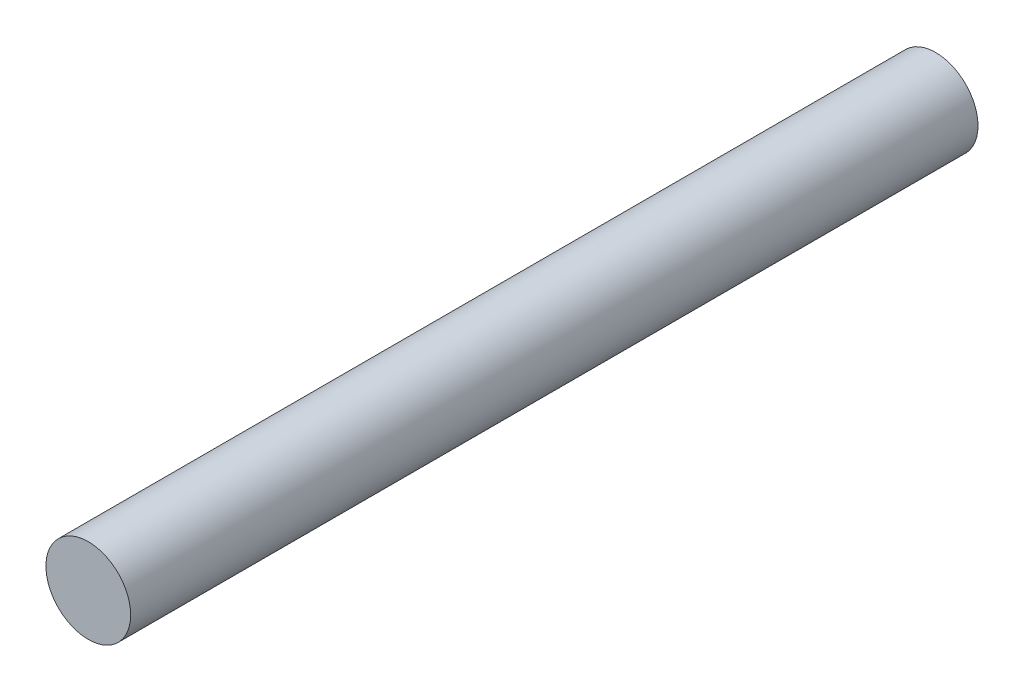
ISO-10303-21;
HEADER;
FILE_DESCRIPTION(('STEP AP214'),'2;1');
FILE_NAME('part.step','',(''),(''),'','','');
FILE_SCHEMA(('AUTOMOTIVE_DESIGN { 1 0 10303 214 1 1 1 1 }'));
ENDSEC;
DATA;
#1=APPLICATION_CONTEXT('core data for automotive mechanical design processes');
#2=APPLICATION_PROTOCOL_DEFINITION('international standard','automotive_design',2000,#1);
#3=PRODUCT_CONTEXT('',#1,'mechanical');
#4=PRODUCT('Part','Part','',(#3));
#5=PRODUCT_RELATED_PRODUCT_CATEGORY('part','',(#4));
#6=PRODUCT_DEFINITION_FORMATION('','',#4);
#7=PRODUCT_DEFINITION_CONTEXT('part definition',#1,'design');
#8=PRODUCT_DEFINITION('design','',#6,#7);
#9=PRODUCT_DEFINITION_SHAPE('','',#8);
#10=(LENGTH_UNIT() NAMED_UNIT(*) SI_UNIT(.MILLI.,.METRE.));
#11=(NAMED_UNIT(*) PLANE_ANGLE_UNIT() SI_UNIT($,.RADIAN.));
#12=(NAMED_UNIT(*) SI_UNIT($,.STERADIAN.) SOLID_ANGLE_UNIT());
#13=UNCERTAINTY_MEASURE_WITH_UNIT(LENGTH_MEASURE(1.E-05),#10,'distance_accuracy_value','');
#14=(GEOMETRIC_REPRESENTATION_CONTEXT(3) GLOBAL_UNCERTAINTY_ASSIGNED_CONTEXT((#13)) GLOBAL_UNIT_ASSIGNED_CONTEXT((#10,
#11,#12)) REPRESENTATION_CONTEXT('',''));
#15=CARTESIAN_POINT('',(0.,0.,0.));
#16=DIRECTION('',(0.,0.,1.));
#17=DIRECTION('',(1.,0.,0.));
#18=AXIS2_PLACEMENT_3D('',#15,#16,#17);
#19=CARTESIAN_POINT('',(0.,0.,20.));
#20=DIRECTION('',(0.,0.,-1.));
#21=DIRECTION('',(-1.,0.,0.));
#22=AXIS2_PLACEMENT_3D('',#19,#20,#21);
#23=CYLINDRICAL_SURFACE('',#22,1.);
#24=CARTESIAN_POINT('',(0.,0.,20.));
#25=DIRECTION('',(0.,0.,1.));
#26=DIRECTION('',(1.,0.,0.));
#27=AXIS2_PLACEMENT_3D('',#24,#25,#26);
#28=CIRCLE('',#27,1.);
#29=CARTESIAN_POINT('',(1.,0.,20.));
#30=VERTEX_POINT('',#29);
#31=EDGE_CURVE('E10',#30,#30,#28,.T.);
#32=ORIENTED_EDGE('',*,*,#31,.F.);
#33=EDGE_LOOP('',(#32));
#34=FACE_BOUND('',#33,.T.);
#35=CARTESIAN_POINT('',(0.,0.,0.));
#36=DIRECTION('',(0.,0.,1.));
#37=DIRECTION('',(1.,0.,0.));
#38=AXIS2_PLACEMENT_3D('',#35,#36,#37);
#39=CIRCLE('',#38,1.);
#40=CARTESIAN_POINT('',(1.,0.,0.));
#41=VERTEX_POINT('',#40);
#42=EDGE_CURVE('E38',#41,#41,#39,.T.);
#43=ORIENTED_EDGE('',*,*,#42,.T.);
#44=EDGE_LOOP('',(#43));
#45=FACE_BOUND('',#44,.T.);
#46=ADVANCED_FACE('F35',(#34,#45),#23,.T.);
#47=CARTESIAN_POINT('',(0.,0.,20.));
#48=DIRECTION('',(0.,0.,1.));
#49=DIRECTION('',(1.,0.,0.));
#50=AXIS2_PLACEMENT_3D('',#47,#48,#49);
#51=PLANE('',#50);
#52=ORIENTED_EDGE('',*,*,#31,.T.);
#53=EDGE_LOOP('',(#52));
#54=FACE_BOUND('',#53,.T.);
#55=ADVANCED_FACE('F50',(#54),#51,.T.);
#56=CARTESIAN_POINT('',(0.,0.,0.));
#57=DIRECTION('',(0.,0.,1.));
#58=DIRECTION('',(1.,0.,0.));
#59=AXIS2_PLACEMENT_3D('',#56,#57,#58);
#60=PLANE('',#59);
#61=ORIENTED_EDGE('',*,*,#42,.F.);
#62=EDGE_LOOP('',(#61));
#63=FACE_BOUND('',#62,.T.);
#64=ADVANCED_FACE('F48',(#63),#60,.F.);
#65=CLOSED_SHELL('',(#46,#55,#64));
#66=MANIFOLD_SOLID_BREP('B2',#65);
#67=ADVANCED_BREP_SHAPE_REPRESENTATION('',(#18,#66),#14);
#68=SHAPE_DEFINITION_REPRESENTATION(#9,#67);
ENDSEC;
END-ISO-10303-21;
